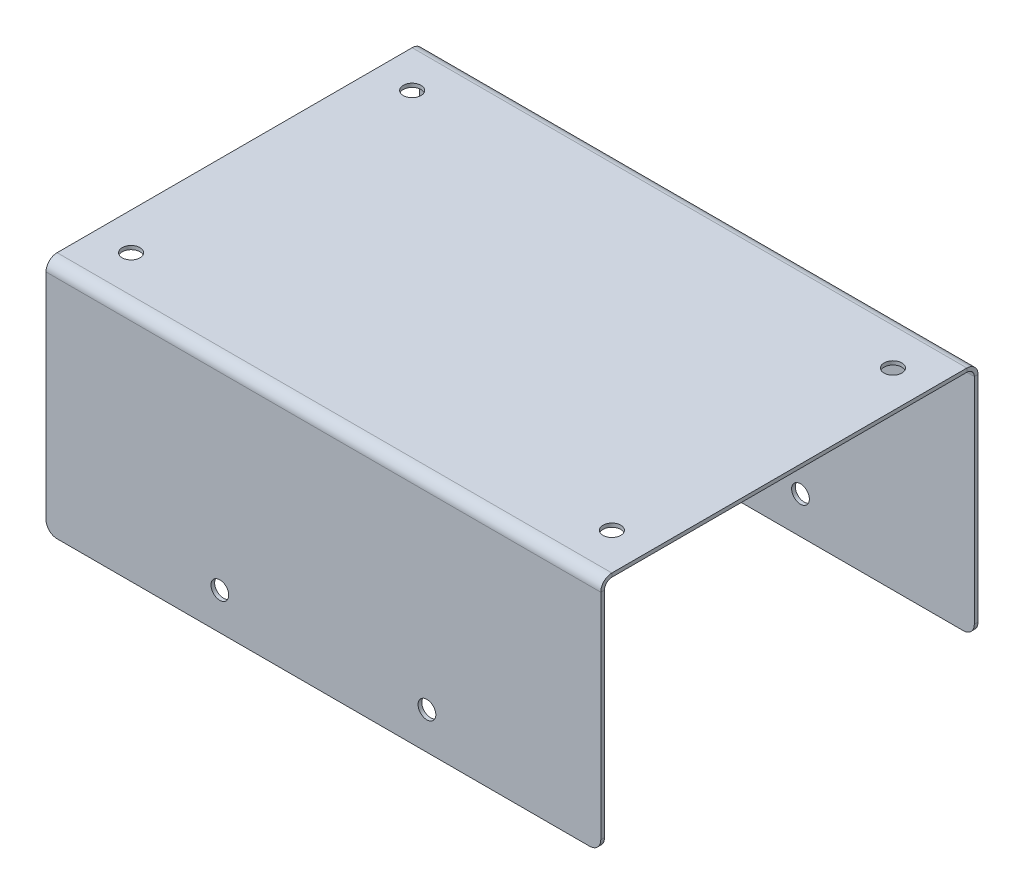
ISO-10303-21;
HEADER;
FILE_DESCRIPTION(('STEP AP214'),'2;1');
FILE_NAME('part.step','',(''),(''),'','','');
FILE_SCHEMA(('AUTOMOTIVE_DESIGN { 1 0 10303 214 1 1 1 1 }'));
ENDSEC;
DATA;
#1=APPLICATION_CONTEXT('core data for automotive mechanical design processes');
#2=APPLICATION_PROTOCOL_DEFINITION('international standard','automotive_design',2000,#1);
#3=PRODUCT_CONTEXT('',#1,'mechanical');
#4=PRODUCT('Part','Part','',(#3));
#5=PRODUCT_RELATED_PRODUCT_CATEGORY('part','',(#4));
#6=PRODUCT_DEFINITION_FORMATION('','',#4);
#7=PRODUCT_DEFINITION_CONTEXT('part definition',#1,'design');
#8=PRODUCT_DEFINITION('design','',#6,#7);
#9=PRODUCT_DEFINITION_SHAPE('','',#8);
#10=(LENGTH_UNIT() NAMED_UNIT(*) SI_UNIT(.MILLI.,.METRE.));
#11=(NAMED_UNIT(*) PLANE_ANGLE_UNIT() SI_UNIT($,.RADIAN.));
#12=(NAMED_UNIT(*) SI_UNIT($,.STERADIAN.) SOLID_ANGLE_UNIT());
#13=UNCERTAINTY_MEASURE_WITH_UNIT(LENGTH_MEASURE(1.E-05),#10,'distance_accuracy_value','');
#14=(GEOMETRIC_REPRESENTATION_CONTEXT(3) GLOBAL_UNCERTAINTY_ASSIGNED_CONTEXT((#13)) GLOBAL_UNIT_ASSIGNED_CONTEXT((#10,
#11,#12)) REPRESENTATION_CONTEXT('',''));
#15=CARTESIAN_POINT('',(0.,0.,0.));
#16=DIRECTION('',(0.,0.,1.));
#17=DIRECTION('',(1.,0.,0.));
#18=AXIS2_PLACEMENT_3D('',#15,#16,#17);
#19=CARTESIAN_POINT('',(0.,-1.,0.));
#20=DIRECTION('',(0.,-1.,0.));
#21=DIRECTION('',(0.,0.,-1.));
#22=AXIS2_PLACEMENT_3D('',#19,#20,#21);
#23=PLANE('',#22);
#24=CARTESIAN_POINT('',(-65.,-1.,-38.));
#25=DIRECTION('',(0.,-1.,0.));
#26=DIRECTION('',(0.,0.,-1.));
#27=AXIS2_PLACEMENT_3D('',#24,#25,#26);
#28=CIRCLE('',#27,2.39999999999999);
#29=CARTESIAN_POINT('',(-65.,-1.,-40.4));
#30=VERTEX_POINT('',#29);
#31=EDGE_CURVE('E659',#30,#30,#28,.T.);
#32=ORIENTED_EDGE('',*,*,#31,.F.);
#33=EDGE_LOOP('',(#32));
#34=FACE_BOUND('',#33,.T.);
#35=CARTESIAN_POINT('',(-65.,-1.,38.));
#36=DIRECTION('',(0.,-1.,0.));
#37=DIRECTION('',(0.,0.,-1.));
#38=AXIS2_PLACEMENT_3D('',#35,#36,#37);
#39=CIRCLE('',#38,2.39999999999999);
#40=CARTESIAN_POINT('',(-65.,-1.,35.6));
#41=VERTEX_POINT('',#40);
#42=EDGE_CURVE('E669',#41,#41,#39,.T.);
#43=ORIENTED_EDGE('',*,*,#42,.F.);
#44=EDGE_LOOP('',(#43));
#45=FACE_BOUND('',#44,.T.);
#46=CARTESIAN_POINT('',(65.,-1.,38.));
#47=DIRECTION('',(0.,-1.,0.));
#48=DIRECTION('',(0.,0.,-1.));
#49=AXIS2_PLACEMENT_3D('',#46,#47,#48);
#50=CIRCLE('',#49,2.39999999999999);
#51=CARTESIAN_POINT('',(65.,-1.,35.6));
#52=VERTEX_POINT('',#51);
#53=EDGE_CURVE('E675',#52,#52,#50,.T.);
#54=ORIENTED_EDGE('',*,*,#53,.F.);
#55=EDGE_LOOP('',(#54));
#56=FACE_BOUND('',#55,.T.);
#57=CARTESIAN_POINT('',(65.,-1.,-38.));
#58=DIRECTION('',(0.,-1.,0.));
#59=DIRECTION('',(0.,0.,-1.));
#60=AXIS2_PLACEMENT_3D('',#57,#58,#59);
#61=CIRCLE('',#60,2.39999999999999);
#62=CARTESIAN_POINT('',(65.,-1.,-40.4));
#63=VERTEX_POINT('',#62);
#64=EDGE_CURVE('E681',#63,#63,#61,.T.);
#65=ORIENTED_EDGE('',*,*,#64,.F.);
#66=EDGE_LOOP('',(#65));
#67=FACE_BOUND('',#66,.T.);
#68=DIRECTION('',(0.,0.,-1.));
#69=VECTOR('',#68,1.);
#70=CARTESIAN_POINT('',(75.,-1.,50.));
#71=LINE('',#70,#69);
#72=CARTESIAN_POINT('',(75.,-0.999999999999997,48.));
#73=VERTEX_POINT('',#72);
#74=CARTESIAN_POINT('',(75.,-1.,-48.));
#75=VERTEX_POINT('',#74);
#76=EDGE_CURVE('E262',#73,#75,#71,.T.);
#77=ORIENTED_EDGE('',*,*,#76,.F.);
#78=DIRECTION('',(-1.,0.,0.));
#79=VECTOR('',#78,1.);
#80=CARTESIAN_POINT('',(-75.,-0.999999999999997,48.));
#81=LINE('',#80,#79);
#82=CARTESIAN_POINT('',(-75.,-0.999999999999997,48.));
#83=VERTEX_POINT('',#82);
#84=EDGE_CURVE('E202',#83,#73,#81,.F.);
#85=ORIENTED_EDGE('',*,*,#84,.F.);
#86=DIRECTION('',(0.,0.,1.));
#87=VECTOR('',#86,1.);
#88=CARTESIAN_POINT('',(-75.,-1.,50.));
#89=LINE('',#88,#87);
#90=CARTESIAN_POINT('',(-75.,-1.,-48.));
#91=VERTEX_POINT('',#90);
#92=EDGE_CURVE('E264',#91,#83,#89,.T.);
#93=ORIENTED_EDGE('',*,*,#92,.F.);
#94=DIRECTION('',(1.,0.,0.));
#95=VECTOR('',#94,1.);
#96=CARTESIAN_POINT('',(75.,-1.,-48.));
#97=LINE('',#96,#95);
#98=EDGE_CURVE('E252',#75,#91,#97,.F.);
#99=ORIENTED_EDGE('',*,*,#98,.F.);
#100=EDGE_LOOP('',(#77,#85,#93,#99));
#101=FACE_BOUND('',#100,.T.);
#102=ADVANCED_FACE('F38',(#34,#45,#56,#67,#101),#23,.T.);
#103=CARTESIAN_POINT('',(0.,0.,0.));
#104=DIRECTION('',(0.,-1.,0.));
#105=DIRECTION('',(0.,0.,-1.));
#106=AXIS2_PLACEMENT_3D('',#103,#104,#105);
#107=PLANE('',#106);
#108=CARTESIAN_POINT('',(-65.,0.,-38.));
#109=DIRECTION('',(0.,1.,0.));
#110=DIRECTION('',(0.,0.,1.));
#111=AXIS2_PLACEMENT_3D('',#108,#109,#110);
#112=CIRCLE('',#111,2.39999999999999);
#113=CARTESIAN_POINT('',(-65.,0.,-35.6));
#114=VERTEX_POINT('',#113);
#115=EDGE_CURVE('E662',#114,#114,#112,.T.);
#116=ORIENTED_EDGE('',*,*,#115,.F.);
#117=EDGE_LOOP('',(#116));
#118=FACE_BOUND('',#117,.T.);
#119=CARTESIAN_POINT('',(-65.,0.,38.));
#120=DIRECTION('',(0.,1.,0.));
#121=DIRECTION('',(0.,0.,1.));
#122=AXIS2_PLACEMENT_3D('',#119,#120,#121);
#123=CIRCLE('',#122,2.39999999999999);
#124=CARTESIAN_POINT('',(-65.,0.,40.4));
#125=VERTEX_POINT('',#124);
#126=EDGE_CURVE('E664',#125,#125,#123,.T.);
#127=ORIENTED_EDGE('',*,*,#126,.F.);
#128=EDGE_LOOP('',(#127));
#129=FACE_BOUND('',#128,.T.);
#130=CARTESIAN_POINT('',(65.,0.,38.));
#131=DIRECTION('',(0.,1.,0.));
#132=DIRECTION('',(0.,0.,1.));
#133=AXIS2_PLACEMENT_3D('',#130,#131,#132);
#134=CIRCLE('',#133,2.39999999999999);
#135=CARTESIAN_POINT('',(65.,0.,40.4));
#136=VERTEX_POINT('',#135);
#137=EDGE_CURVE('E672',#136,#136,#134,.T.);
#138=ORIENTED_EDGE('',*,*,#137,.F.);
#139=EDGE_LOOP('',(#138));
#140=FACE_BOUND('',#139,.T.);
#141=CARTESIAN_POINT('',(65.,0.,-38.));
#142=DIRECTION('',(0.,1.,0.));
#143=DIRECTION('',(0.,0.,1.));
#144=AXIS2_PLACEMENT_3D('',#141,#142,#143);
#145=CIRCLE('',#144,2.39999999999999);
#146=CARTESIAN_POINT('',(65.,0.,-35.6));
#147=VERTEX_POINT('',#146);
#148=EDGE_CURVE('E678',#147,#147,#145,.T.);
#149=ORIENTED_EDGE('',*,*,#148,.F.);
#150=EDGE_LOOP('',(#149));
#151=FACE_BOUND('',#150,.T.);
#152=DIRECTION('',(-1.,0.,0.));
#153=VECTOR('',#152,1.);
#154=CARTESIAN_POINT('',(-75.,0.,48.));
#155=LINE('',#154,#153);
#156=CARTESIAN_POINT('',(-75.,0.,48.));
#157=VERTEX_POINT('',#156);
#158=CARTESIAN_POINT('',(75.,0.,48.));
#159=VERTEX_POINT('',#158);
#160=EDGE_CURVE('E168',#157,#159,#155,.F.);
#161=ORIENTED_EDGE('',*,*,#160,.T.);
#162=DIRECTION('',(0.,0.,-1.));
#163=VECTOR('',#162,1.);
#164=CARTESIAN_POINT('',(75.,0.,50.));
#165=LINE('',#164,#163);
#166=CARTESIAN_POINT('',(75.,0.,-48.));
#167=VERTEX_POINT('',#166);
#168=EDGE_CURVE('E260',#159,#167,#165,.T.);
#169=ORIENTED_EDGE('',*,*,#168,.T.);
#170=DIRECTION('',(1.,0.,0.));
#171=VECTOR('',#170,1.);
#172=CARTESIAN_POINT('',(75.,0.,-48.));
#173=LINE('',#172,#171);
#174=CARTESIAN_POINT('',(-75.,0.,-48.));
#175=VERTEX_POINT('',#174);
#176=EDGE_CURVE('E240',#167,#175,#173,.F.);
#177=ORIENTED_EDGE('',*,*,#176,.T.);
#178=DIRECTION('',(0.,0.,1.));
#179=VECTOR('',#178,1.);
#180=CARTESIAN_POINT('',(-75.,0.,50.));
#181=LINE('',#180,#179);
#182=EDGE_CURVE('E265',#175,#157,#181,.T.);
#183=ORIENTED_EDGE('',*,*,#182,.T.);
#184=EDGE_LOOP('',(#161,#169,#177,#183));
#185=FACE_BOUND('',#184,.T.);
#186=ADVANCED_FACE('F354',(#118,#129,#140,#151,#185),#107,.F.);
#187=CARTESIAN_POINT('',(-75.,-1.,50.));
#188=DIRECTION('',(-1.,0.,0.));
#189=DIRECTION('',(0.,0.,1.));
#190=AXIS2_PLACEMENT_3D('',#187,#188,#189);
#191=PLANE('',#190);
#192=ORIENTED_EDGE('',*,*,#92,.T.);
#193=DIRECTION('',(0.,1.,0.));
#194=VECTOR('',#193,1.);
#195=CARTESIAN_POINT('',(-75.,-0.999999999999997,48.));
#196=LINE('',#195,#194);
#197=EDGE_CURVE('E198',#83,#157,#196,.T.);
#198=ORIENTED_EDGE('',*,*,#197,.T.);
#199=ORIENTED_EDGE('',*,*,#182,.F.);
#200=DIRECTION('',(0.,1.,0.));
#201=VECTOR('',#200,1.);
#202=CARTESIAN_POINT('',(-75.,-1.,-48.));
#203=LINE('',#202,#201);
#204=EDGE_CURVE('E257',#91,#175,#203,.T.);
#205=ORIENTED_EDGE('',*,*,#204,.F.);
#206=EDGE_LOOP('',(#192,#198,#199,#205));
#207=FACE_BOUND('',#206,.T.);
#208=ADVANCED_FACE('F361',(#207),#191,.T.);
#209=CARTESIAN_POINT('',(75.,-1.,50.));
#210=DIRECTION('',(1.,0.,0.));
#211=DIRECTION('',(0.,0.,-1.));
#212=AXIS2_PLACEMENT_3D('',#209,#210,#211);
#213=PLANE('',#212);
#214=DIRECTION('',(0.,1.,0.));
#215=VECTOR('',#214,1.);
#216=CARTESIAN_POINT('',(75.,-0.999999999999997,48.));
#217=LINE('',#216,#215);
#218=EDGE_CURVE('E206',#73,#159,#217,.T.);
#219=ORIENTED_EDGE('',*,*,#218,.F.);
#220=ORIENTED_EDGE('',*,*,#76,.T.);
#221=DIRECTION('',(0.,1.,0.));
#222=VECTOR('',#221,1.);
#223=CARTESIAN_POINT('',(75.,-1.,-48.));
#224=LINE('',#223,#222);
#225=EDGE_CURVE('E246',#75,#167,#224,.T.);
#226=ORIENTED_EDGE('',*,*,#225,.T.);
#227=ORIENTED_EDGE('',*,*,#168,.F.);
#228=EDGE_LOOP('',(#219,#220,#226,#227));
#229=FACE_BOUND('',#228,.T.);
#230=ADVANCED_FACE('F372',(#229),#213,.T.);
#231=CARTESIAN_POINT('',(-75.,-3.00000000000001,-48.));
#232=DIRECTION('',(-1.,0.,0.));
#233=DIRECTION('',(0.,0.,1.));
#234=AXIS2_PLACEMENT_3D('',#231,#232,#233);
#235=PLANE('',#234);
#236=DIRECTION('',(0.,0.,-1.));
#237=VECTOR('',#236,1.);
#238=CARTESIAN_POINT('',(-75.,-3.,-50.));
#239=LINE('',#238,#237);
#240=CARTESIAN_POINT('',(-75.,-3.,-50.));
#241=VERTEX_POINT('',#240);
#242=CARTESIAN_POINT('',(-75.,-3.,-51.));
#243=VERTEX_POINT('',#242);
#244=EDGE_CURVE('E209',#241,#243,#239,.T.);
#245=ORIENTED_EDGE('',*,*,#244,.F.);
#246=CARTESIAN_POINT('',(-75.,-3.00000000000001,-48.));
#247=DIRECTION('',(1.,0.,0.));
#248=DIRECTION('',(0.,0.,-1.));
#249=AXIS2_PLACEMENT_3D('',#246,#247,#248);
#250=CIRCLE('',#249,2.);
#251=EDGE_CURVE('E249',#91,#241,#250,.F.);
#252=ORIENTED_EDGE('',*,*,#251,.F.);
#253=ORIENTED_EDGE('',*,*,#204,.T.);
#254=CARTESIAN_POINT('',(-75.,-3.00000000000001,-48.));
#255=DIRECTION('',(1.,0.,0.));
#256=DIRECTION('',(0.,0.,-1.));
#257=AXIS2_PLACEMENT_3D('',#254,#255,#256);
#258=CIRCLE('',#257,3.);
#259=EDGE_CURVE('E242',#175,#243,#258,.F.);
#260=ORIENTED_EDGE('',*,*,#259,.T.);
#261=EDGE_LOOP('',(#245,#252,#253,#260));
#262=FACE_BOUND('',#261,.T.);
#263=ADVANCED_FACE('F376',(#262),#235,.T.);
#264=CARTESIAN_POINT('',(75.,-3.00000000000001,-48.));
#265=DIRECTION('',(-1.,0.,0.));
#266=DIRECTION('',(0.,0.,1.));
#267=AXIS2_PLACEMENT_3D('',#264,#265,#266);
#268=PLANE('',#267);
#269=CARTESIAN_POINT('',(75.,-3.00000000000001,-48.));
#270=DIRECTION('',(1.,0.,0.));
#271=DIRECTION('',(0.,0.,-1.));
#272=AXIS2_PLACEMENT_3D('',#269,#270,#271);
#273=CIRCLE('',#272,2.);
#274=CARTESIAN_POINT('',(75.,-3.,-50.));
#275=VERTEX_POINT('',#274);
#276=EDGE_CURVE('E233',#275,#75,#273,.T.);
#277=ORIENTED_EDGE('',*,*,#276,.F.);
#278=DIRECTION('',(0.,0.,-1.));
#279=VECTOR('',#278,1.);
#280=CARTESIAN_POINT('',(75.,-2.99999999999999,-50.));
#281=LINE('',#280,#279);
#282=CARTESIAN_POINT('',(75.,-2.99999999999999,-51.));
#283=VERTEX_POINT('',#282);
#284=EDGE_CURVE('E215',#275,#283,#281,.T.);
#285=ORIENTED_EDGE('',*,*,#284,.T.);
#286=CARTESIAN_POINT('',(75.,-3.00000000000001,-48.));
#287=DIRECTION('',(1.,0.,0.));
#288=DIRECTION('',(0.,0.,-1.));
#289=AXIS2_PLACEMENT_3D('',#286,#287,#288);
#290=CIRCLE('',#289,3.);
#291=EDGE_CURVE('E243',#283,#167,#290,.T.);
#292=ORIENTED_EDGE('',*,*,#291,.T.);
#293=ORIENTED_EDGE('',*,*,#225,.F.);
#294=EDGE_LOOP('',(#277,#285,#292,#293));
#295=FACE_BOUND('',#294,.T.);
#296=ADVANCED_FACE('F367',(#295),#268,.F.);
#297=CARTESIAN_POINT('',(75.,-3.00000000000001,-48.));
#298=DIRECTION('',(1.,0.,0.));
#299=DIRECTION('',(0.,0.,-1.));
#300=AXIS2_PLACEMENT_3D('',#297,#298,#299);
#301=CYLINDRICAL_SURFACE('',#300,3.);
#302=ORIENTED_EDGE('',*,*,#176,.F.);
#303=ORIENTED_EDGE('',*,*,#291,.F.);
#304=DIRECTION('',(1.,0.,0.));
#305=VECTOR('',#304,1.);
#306=CARTESIAN_POINT('',(0.,-2.99999999999999,-51.));
#307=LINE('',#306,#305);
#308=EDGE_CURVE('E218',#243,#283,#307,.T.);
#309=ORIENTED_EDGE('',*,*,#308,.F.);
#310=ORIENTED_EDGE('',*,*,#259,.F.);
#311=EDGE_LOOP('',(#302,#303,#309,#310));
#312=FACE_BOUND('',#311,.T.);
#313=ADVANCED_FACE('F421',(#312),#301,.T.);
#314=CARTESIAN_POINT('',(75.,-3.00000000000001,-48.));
#315=DIRECTION('',(1.,0.,0.));
#316=DIRECTION('',(0.,0.,-1.));
#317=AXIS2_PLACEMENT_3D('',#314,#315,#316);
#318=CYLINDRICAL_SURFACE('',#317,2.);
#319=ORIENTED_EDGE('',*,*,#98,.T.);
#320=ORIENTED_EDGE('',*,*,#251,.T.);
#321=DIRECTION('',(1.,0.,0.));
#322=VECTOR('',#321,1.);
#323=CARTESIAN_POINT('',(-75.,-3.,-50.));
#324=LINE('',#323,#322);
#325=EDGE_CURVE('E212',#241,#275,#324,.T.);
#326=ORIENTED_EDGE('',*,*,#325,.T.);
#327=ORIENTED_EDGE('',*,*,#276,.T.);
#328=EDGE_LOOP('',(#319,#320,#326,#327));
#329=FACE_BOUND('',#328,.T.);
#330=ADVANCED_FACE('F407',(#329),#318,.F.);
#331=CARTESIAN_POINT('',(75.,-0.999999999999997,-51.));
#332=DIRECTION('',(1.,0.,0.));
#333=DIRECTION('',(0.,0.,-1.));
#334=AXIS2_PLACEMENT_3D('',#331,#332,#333);
#335=PLANE('',#334);
#336=DIRECTION('',(0.,1.,0.));
#337=VECTOR('',#336,1.);
#338=CARTESIAN_POINT('',(75.,-1.,-50.));
#339=LINE('',#338,#337);
#340=CARTESIAN_POINT('',(75.,-61.,-50.0000000000002));
#341=VERTEX_POINT('',#340);
#342=EDGE_CURVE('E228',#341,#275,#339,.T.);
#343=ORIENTED_EDGE('',*,*,#342,.F.);
#344=DIRECTION('',(0.,0.,1.));
#345=VECTOR('',#344,1.);
#346=CARTESIAN_POINT('',(75.,-61.,-51.0000000000002));
#347=LINE('',#346,#345);
#348=CARTESIAN_POINT('',(75.,-61.,-51.0000000000002));
#349=VERTEX_POINT('',#348);
#350=EDGE_CURVE('E280',#341,#349,#347,.F.);
#351=ORIENTED_EDGE('',*,*,#350,.T.);
#352=DIRECTION('',(0.,1.,0.));
#353=VECTOR('',#352,1.);
#354=CARTESIAN_POINT('',(75.,-0.999999999999997,-51.));
#355=LINE('',#354,#353);
#356=EDGE_CURVE('E231',#349,#283,#355,.T.);
#357=ORIENTED_EDGE('',*,*,#356,.T.);
#358=ORIENTED_EDGE('',*,*,#284,.F.);
#359=EDGE_LOOP('',(#343,#351,#357,#358));
#360=FACE_BOUND('',#359,.T.);
#361=ADVANCED_FACE('F415',(#360),#335,.T.);
#362=CARTESIAN_POINT('',(-75.,-64.,-51.0000000000002));
#363=DIRECTION('',(-1.,0.,0.));
#364=DIRECTION('',(0.,0.,1.));
#365=AXIS2_PLACEMENT_3D('',#362,#363,#364);
#366=PLANE('',#365);
#367=DIRECTION('',(0.,-1.,0.));
#368=VECTOR('',#367,1.);
#369=CARTESIAN_POINT('',(-75.,-64.,-51.0000000000002));
#370=LINE('',#369,#368);
#371=CARTESIAN_POINT('',(-75.,-61.,-51.0000000000002));
#372=VERTEX_POINT('',#371);
#373=EDGE_CURVE('E224',#243,#372,#370,.T.);
#374=ORIENTED_EDGE('',*,*,#373,.T.);
#375=DIRECTION('',(0.,0.,1.));
#376=VECTOR('',#375,1.);
#377=CARTESIAN_POINT('',(-75.,-61.,-51.0000000000002));
#378=LINE('',#377,#376);
#379=CARTESIAN_POINT('',(-75.,-61.,-50.0000000000002));
#380=VERTEX_POINT('',#379);
#381=EDGE_CURVE('E286',#372,#380,#378,.T.);
#382=ORIENTED_EDGE('',*,*,#381,.T.);
#383=DIRECTION('',(0.,-1.,0.));
#384=VECTOR('',#383,1.);
#385=CARTESIAN_POINT('',(-75.,-64.,-50.0000000000002));
#386=LINE('',#385,#384);
#387=EDGE_CURVE('E223',#241,#380,#386,.T.);
#388=ORIENTED_EDGE('',*,*,#387,.F.);
#389=ORIENTED_EDGE('',*,*,#244,.T.);
#390=EDGE_LOOP('',(#374,#382,#388,#389));
#391=FACE_BOUND('',#390,.T.);
#392=ADVANCED_FACE('F400',(#391),#366,.T.);
#393=CARTESIAN_POINT('',(0.,1.79717358263471E-13,-51.));
#394=DIRECTION('',(0.,0.,-1.));
#395=DIRECTION('',(0.,1.,0.));
#396=AXIS2_PLACEMENT_3D('',#393,#394,#395);
#397=PLANE('',#396);
#398=CARTESIAN_POINT('',(28.,-54.,-51.0000000000002));
#399=DIRECTION('',(0.,0.,-1.));
#400=DIRECTION('',(0.,1.,0.));
#401=AXIS2_PLACEMENT_3D('',#398,#399,#400);
#402=CIRCLE('',#401,2.4);
#403=CARTESIAN_POINT('',(28.,-51.6,-51.0000000000002));
#404=VERTEX_POINT('',#403);
#405=EDGE_CURVE('E684',#404,#404,#402,.T.);
#406=ORIENTED_EDGE('',*,*,#405,.F.);
#407=EDGE_LOOP('',(#406));
#408=FACE_BOUND('',#407,.T.);
#409=CARTESIAN_POINT('',(-28.,-54.,-51.0000000000002));
#410=DIRECTION('',(0.,0.,-1.));
#411=DIRECTION('',(0.,1.,0.));
#412=AXIS2_PLACEMENT_3D('',#409,#410,#411);
#413=CIRCLE('',#412,2.4);
#414=CARTESIAN_POINT('',(-28.,-51.6,-51.0000000000002));
#415=VERTEX_POINT('',#414);
#416=EDGE_CURVE('E311',#415,#415,#413,.T.);
#417=ORIENTED_EDGE('',*,*,#416,.F.);
#418=EDGE_LOOP('',(#417));
#419=FACE_BOUND('',#418,.T.);
#420=ORIENTED_EDGE('',*,*,#356,.F.);
#421=CARTESIAN_POINT('',(72.,-61.,-51.0000000000002));
#422=DIRECTION('',(0.,0.,-1.));
#423=DIRECTION('',(0.,1.,0.));
#424=AXIS2_PLACEMENT_3D('',#421,#422,#423);
#425=CIRCLE('',#424,3.);
#426=CARTESIAN_POINT('',(72.,-64.,-51.0000000000002));
#427=VERTEX_POINT('',#426);
#428=EDGE_CURVE('E284',#349,#427,#425,.T.);
#429=ORIENTED_EDGE('',*,*,#428,.T.);
#430=DIRECTION('',(1.,0.,0.));
#431=VECTOR('',#430,1.);
#432=CARTESIAN_POINT('',(75.,-64.,-51.0000000000002));
#433=LINE('',#432,#431);
#434=CARTESIAN_POINT('',(-72.,-64.,-51.0000000000002));
#435=VERTEX_POINT('',#434);
#436=EDGE_CURVE('E227',#435,#427,#433,.T.);
#437=ORIENTED_EDGE('',*,*,#436,.F.);
#438=CARTESIAN_POINT('',(-72.,-61.,-51.0000000000002));
#439=DIRECTION('',(0.,0.,-1.));
#440=DIRECTION('',(0.,1.,0.));
#441=AXIS2_PLACEMENT_3D('',#438,#439,#440);
#442=CIRCLE('',#441,3.);
#443=EDGE_CURVE('E282',#435,#372,#442,.T.);
#444=ORIENTED_EDGE('',*,*,#443,.T.);
#445=ORIENTED_EDGE('',*,*,#373,.F.);
#446=ORIENTED_EDGE('',*,*,#308,.T.);
#447=EDGE_LOOP('',(#420,#429,#437,#444,#445,#446));
#448=FACE_BOUND('',#447,.T.);
#449=ADVANCED_FACE('F391',(#408,#419,#448),#397,.T.);
#450=CARTESIAN_POINT('',(0.,1.76225876924628E-13,-50.));
#451=DIRECTION('',(0.,0.,-1.));
#452=DIRECTION('',(0.,1.,0.));
#453=AXIS2_PLACEMENT_3D('',#450,#451,#452);
#454=PLANE('',#453);
#455=CARTESIAN_POINT('',(28.,-54.,-50.0000000000002));
#456=DIRECTION('',(0.,0.,-1.));
#457=DIRECTION('',(0.,1.,0.));
#458=AXIS2_PLACEMENT_3D('',#455,#456,#457);
#459=CIRCLE('',#458,2.39999999999999);
#460=CARTESIAN_POINT('',(28.,-51.6,-50.0000000000002));
#461=VERTEX_POINT('',#460);
#462=EDGE_CURVE('E316',#461,#461,#459,.T.);
#463=ORIENTED_EDGE('',*,*,#462,.T.);
#464=EDGE_LOOP('',(#463));
#465=FACE_BOUND('',#464,.T.);
#466=CARTESIAN_POINT('',(-28.,-54.,-50.0000000000002));
#467=DIRECTION('',(0.,0.,-1.));
#468=DIRECTION('',(0.,1.,0.));
#469=AXIS2_PLACEMENT_3D('',#466,#467,#468);
#470=CIRCLE('',#469,2.39999999999999);
#471=CARTESIAN_POINT('',(-28.,-51.6,-50.0000000000002));
#472=VERTEX_POINT('',#471);
#473=EDGE_CURVE('E304',#472,#472,#470,.T.);
#474=ORIENTED_EDGE('',*,*,#473,.T.);
#475=EDGE_LOOP('',(#474));
#476=FACE_BOUND('',#475,.T.);
#477=DIRECTION('',(1.,0.,0.));
#478=VECTOR('',#477,1.);
#479=CARTESIAN_POINT('',(75.,-64.,-50.0000000000002));
#480=LINE('',#479,#478);
#481=CARTESIAN_POINT('',(-72.,-64.,-50.0000000000002));
#482=VERTEX_POINT('',#481);
#483=CARTESIAN_POINT('',(72.,-64.,-50.0000000000002));
#484=VERTEX_POINT('',#483);
#485=EDGE_CURVE('E236',#482,#484,#480,.T.);
#486=ORIENTED_EDGE('',*,*,#485,.T.);
#487=CARTESIAN_POINT('',(72.,-61.,-50.0000000000002));
#488=DIRECTION('',(0.,0.,-1.));
#489=DIRECTION('',(0.,1.,0.));
#490=AXIS2_PLACEMENT_3D('',#487,#488,#489);
#491=CIRCLE('',#490,3.);
#492=EDGE_CURVE('E278',#484,#341,#491,.F.);
#493=ORIENTED_EDGE('',*,*,#492,.T.);
#494=ORIENTED_EDGE('',*,*,#342,.T.);
#495=ORIENTED_EDGE('',*,*,#325,.F.);
#496=ORIENTED_EDGE('',*,*,#387,.T.);
#497=CARTESIAN_POINT('',(-72.,-61.,-50.0000000000002));
#498=DIRECTION('',(0.,0.,-1.));
#499=DIRECTION('',(0.,1.,0.));
#500=AXIS2_PLACEMENT_3D('',#497,#498,#499);
#501=CIRCLE('',#500,3.);
#502=EDGE_CURVE('E276',#380,#482,#501,.F.);
#503=ORIENTED_EDGE('',*,*,#502,.T.);
#504=EDGE_LOOP('',(#486,#493,#494,#495,#496,#503));
#505=FACE_BOUND('',#504,.T.);
#506=ADVANCED_FACE('F411',(#465,#476,#505),#454,.F.);
#507=CARTESIAN_POINT('',(75.,-64.,-51.0000000000002));
#508=DIRECTION('',(0.,-1.,0.));
#509=DIRECTION('',(0.,0.,-1.));
#510=AXIS2_PLACEMENT_3D('',#507,#508,#509);
#511=PLANE('',#510);
#512=ORIENTED_EDGE('',*,*,#436,.T.);
#513=DIRECTION('',(0.,0.,1.));
#514=VECTOR('',#513,1.);
#515=CARTESIAN_POINT('',(72.,-64.,-51.0000000000002));
#516=LINE('',#515,#514);
#517=EDGE_CURVE('E273',#427,#484,#516,.T.);
#518=ORIENTED_EDGE('',*,*,#517,.T.);
#519=ORIENTED_EDGE('',*,*,#485,.F.);
#520=DIRECTION('',(0.,0.,1.));
#521=VECTOR('',#520,1.);
#522=CARTESIAN_POINT('',(-72.,-64.,-51.0000000000002));
#523=LINE('',#522,#521);
#524=EDGE_CURVE('E268',#482,#435,#523,.F.);
#525=ORIENTED_EDGE('',*,*,#524,.T.);
#526=EDGE_LOOP('',(#512,#518,#519,#525));
#527=FACE_BOUND('',#526,.T.);
#528=ADVANCED_FACE('F394',(#527),#511,.T.);
#529=CARTESIAN_POINT('',(75.,-3.,48.));
#530=DIRECTION('',(1.,0.,0.));
#531=DIRECTION('',(0.,0.,-1.));
#532=AXIS2_PLACEMENT_3D('',#529,#530,#531);
#533=PLANE('',#532);
#534=DIRECTION('',(0.,0.,1.));
#535=VECTOR('',#534,1.);
#536=CARTESIAN_POINT('',(75.,-3.,50.));
#537=LINE('',#536,#535);
#538=CARTESIAN_POINT('',(75.,-2.99999999999999,50.));
#539=VERTEX_POINT('',#538);
#540=CARTESIAN_POINT('',(75.,-2.99999999999999,51.));
#541=VERTEX_POINT('',#540);
#542=EDGE_CURVE('E189',#539,#541,#537,.T.);
#543=ORIENTED_EDGE('',*,*,#542,.F.);
#544=CARTESIAN_POINT('',(75.,-3.,48.));
#545=DIRECTION('',(-1.,0.,0.));
#546=DIRECTION('',(0.,0.,1.));
#547=AXIS2_PLACEMENT_3D('',#544,#545,#546);
#548=CIRCLE('',#547,2.);
#549=EDGE_CURVE('E171',#73,#539,#548,.F.);
#550=ORIENTED_EDGE('',*,*,#549,.F.);
#551=ORIENTED_EDGE('',*,*,#218,.T.);
#552=CARTESIAN_POINT('',(75.,-3.,48.));
#553=DIRECTION('',(-1.,0.,0.));
#554=DIRECTION('',(0.,0.,1.));
#555=AXIS2_PLACEMENT_3D('',#552,#553,#554);
#556=CIRCLE('',#555,3.);
#557=EDGE_CURVE('E197',#159,#541,#556,.F.);
#558=ORIENTED_EDGE('',*,*,#557,.T.);
#559=EDGE_LOOP('',(#543,#550,#551,#558));
#560=FACE_BOUND('',#559,.T.);
#561=ADVANCED_FACE('F330',(#560),#533,.T.);
#562=CARTESIAN_POINT('',(-75.,-3.,48.));
#563=DIRECTION('',(1.,0.,0.));
#564=DIRECTION('',(0.,0.,-1.));
#565=AXIS2_PLACEMENT_3D('',#562,#563,#564);
#566=PLANE('',#565);
#567=CARTESIAN_POINT('',(-75.,-3.,48.));
#568=DIRECTION('',(-1.,0.,0.));
#569=DIRECTION('',(0.,0.,1.));
#570=AXIS2_PLACEMENT_3D('',#567,#568,#569);
#571=CIRCLE('',#570,2.);
#572=CARTESIAN_POINT('',(-75.,-2.99999999999999,50.));
#573=VERTEX_POINT('',#572);
#574=EDGE_CURVE('E157',#573,#83,#571,.T.);
#575=ORIENTED_EDGE('',*,*,#574,.F.);
#576=DIRECTION('',(0.,0.,1.));
#577=VECTOR('',#576,1.);
#578=CARTESIAN_POINT('',(-75.,-3.,50.));
#579=LINE('',#578,#577);
#580=CARTESIAN_POINT('',(-75.,-3.,51.));
#581=VERTEX_POINT('',#580);
#582=EDGE_CURVE('E155',#573,#581,#579,.T.);
#583=ORIENTED_EDGE('',*,*,#582,.T.);
#584=CARTESIAN_POINT('',(-75.,-3.,48.));
#585=DIRECTION('',(-1.,0.,0.));
#586=DIRECTION('',(0.,0.,1.));
#587=AXIS2_PLACEMENT_3D('',#584,#585,#586);
#588=CIRCLE('',#587,3.);
#589=EDGE_CURVE('E163',#581,#157,#588,.T.);
#590=ORIENTED_EDGE('',*,*,#589,.T.);
#591=ORIENTED_EDGE('',*,*,#197,.F.);
#592=EDGE_LOOP('',(#575,#583,#590,#591));
#593=FACE_BOUND('',#592,.T.);
#594=ADVANCED_FACE('F174',(#593),#566,.F.);
#595=CARTESIAN_POINT('',(-75.,-3.,48.));
#596=DIRECTION('',(-1.,0.,0.));
#597=DIRECTION('',(0.,0.,1.));
#598=AXIS2_PLACEMENT_3D('',#595,#596,#597);
#599=CYLINDRICAL_SURFACE('',#598,3.);
#600=ORIENTED_EDGE('',*,*,#160,.F.);
#601=ORIENTED_EDGE('',*,*,#589,.F.);
#602=DIRECTION('',(1.,0.,0.));
#603=VECTOR('',#602,1.);
#604=CARTESIAN_POINT('',(0.,-3.,51.));
#605=LINE('',#604,#603);
#606=EDGE_CURVE('E166',#581,#541,#605,.T.);
#607=ORIENTED_EDGE('',*,*,#606,.T.);
#608=ORIENTED_EDGE('',*,*,#557,.F.);
#609=EDGE_LOOP('',(#600,#601,#607,#608));
#610=FACE_BOUND('',#609,.T.);
#611=ADVANCED_FACE('F164',(#610),#599,.T.);
#612=CARTESIAN_POINT('',(-75.,-3.,48.));
#613=DIRECTION('',(-1.,0.,0.));
#614=DIRECTION('',(0.,0.,1.));
#615=AXIS2_PLACEMENT_3D('',#612,#613,#614);
#616=CYLINDRICAL_SURFACE('',#615,2.);
#617=ORIENTED_EDGE('',*,*,#84,.T.);
#618=ORIENTED_EDGE('',*,*,#549,.T.);
#619=DIRECTION('',(-1.,0.,0.));
#620=VECTOR('',#619,1.);
#621=CARTESIAN_POINT('',(75.,-3.,50.));
#622=LINE('',#621,#620);
#623=EDGE_CURVE('E176',#539,#573,#622,.T.);
#624=ORIENTED_EDGE('',*,*,#623,.T.);
#625=ORIENTED_EDGE('',*,*,#574,.T.);
#626=EDGE_LOOP('',(#617,#618,#624,#625));
#627=FACE_BOUND('',#626,.T.);
#628=ADVANCED_FACE('F331',(#627),#616,.F.);
#629=CARTESIAN_POINT('',(-75.,-64.,51.0000000000002));
#630=DIRECTION('',(-1.,0.,0.));
#631=DIRECTION('',(0.,0.,1.));
#632=AXIS2_PLACEMENT_3D('',#629,#630,#631);
#633=PLANE('',#632);
#634=DIRECTION('',(0.,1.,0.));
#635=VECTOR('',#634,1.);
#636=CARTESIAN_POINT('',(-75.,-64.,50.0000000000002));
#637=LINE('',#636,#635);
#638=CARTESIAN_POINT('',(-75.,-61.,50.0000000000002));
#639=VERTEX_POINT('',#638);
#640=EDGE_CURVE('E191',#639,#573,#637,.T.);
#641=ORIENTED_EDGE('',*,*,#640,.F.);
#642=DIRECTION('',(0.,0.,-1.));
#643=VECTOR('',#642,1.);
#644=CARTESIAN_POINT('',(-75.,-61.,51.0000000000002));
#645=LINE('',#644,#643);
#646=CARTESIAN_POINT('',(-75.,-61.,51.0000000000002));
#647=VERTEX_POINT('',#646);
#648=EDGE_CURVE('E11',#639,#647,#645,.F.);
#649=ORIENTED_EDGE('',*,*,#648,.T.);
#650=DIRECTION('',(0.,1.,0.));
#651=VECTOR('',#650,1.);
#652=CARTESIAN_POINT('',(-75.,-64.,51.0000000000002));
#653=LINE('',#652,#651);
#654=EDGE_CURVE('E151',#647,#581,#653,.T.);
#655=ORIENTED_EDGE('',*,*,#654,.T.);
#656=ORIENTED_EDGE('',*,*,#582,.F.);
#657=EDGE_LOOP('',(#641,#649,#655,#656));
#658=FACE_BOUND('',#657,.T.);
#659=ADVANCED_FACE('F153',(#658),#633,.T.);
#660=CARTESIAN_POINT('',(75.,-0.999999999999997,51.));
#661=DIRECTION('',(1.,0.,0.));
#662=DIRECTION('',(0.,0.,-1.));
#663=AXIS2_PLACEMENT_3D('',#660,#661,#662);
#664=PLANE('',#663);
#665=DIRECTION('',(0.,-1.,0.));
#666=VECTOR('',#665,1.);
#667=CARTESIAN_POINT('',(75.,-0.999999999999997,51.));
#668=LINE('',#667,#666);
#669=CARTESIAN_POINT('',(75.,-61.,51.0000000000002));
#670=VERTEX_POINT('',#669);
#671=EDGE_CURVE('E181',#541,#670,#668,.T.);
#672=ORIENTED_EDGE('',*,*,#671,.T.);
#673=DIRECTION('',(0.,0.,-1.));
#674=VECTOR('',#673,1.);
#675=CARTESIAN_POINT('',(75.,-61.,51.0000000000002));
#676=LINE('',#675,#674);
#677=CARTESIAN_POINT('',(75.,-61.,50.0000000000002));
#678=VERTEX_POINT('',#677);
#679=EDGE_CURVE('E289',#670,#678,#676,.T.);
#680=ORIENTED_EDGE('',*,*,#679,.T.);
#681=DIRECTION('',(0.,-1.,0.));
#682=VECTOR('',#681,1.);
#683=CARTESIAN_POINT('',(75.,-1.,50.));
#684=LINE('',#683,#682);
#685=EDGE_CURVE('E182',#539,#678,#684,.T.);
#686=ORIENTED_EDGE('',*,*,#685,.F.);
#687=ORIENTED_EDGE('',*,*,#542,.T.);
#688=EDGE_LOOP('',(#672,#680,#686,#687));
#689=FACE_BOUND('',#688,.T.);
#690=ADVANCED_FACE('F326',(#689),#664,.T.);
#691=CARTESIAN_POINT('',(0.,1.79717358263471E-13,51.));
#692=DIRECTION('',(0.,0.,-1.));
#693=DIRECTION('',(0.,1.,0.));
#694=AXIS2_PLACEMENT_3D('',#691,#692,#693);
#695=PLANE('',#694);
#696=CARTESIAN_POINT('',(28.,-54.0000000000003,51.0000000000003));
#697=DIRECTION('',(0.,0.,-1.));
#698=DIRECTION('',(0.,1.,0.));
#699=AXIS2_PLACEMENT_3D('',#696,#697,#698);
#700=CIRCLE('',#699,2.39999999999999);
#701=CARTESIAN_POINT('',(28.,-51.6000000000004,51.0000000000003));
#702=VERTEX_POINT('',#701);
#703=EDGE_CURVE('E687',#702,#702,#700,.T.);
#704=ORIENTED_EDGE('',*,*,#703,.T.);
#705=EDGE_LOOP('',(#704));
#706=FACE_BOUND('',#705,.T.);
#707=CARTESIAN_POINT('',(-28.,-54.0000000000003,51.0000000000003));
#708=DIRECTION('',(0.,0.,-1.));
#709=DIRECTION('',(0.,1.,0.));
#710=AXIS2_PLACEMENT_3D('',#707,#708,#709);
#711=CIRCLE('',#710,2.39999999999999);
#712=CARTESIAN_POINT('',(-28.,-51.6000000000004,51.0000000000003));
#713=VERTEX_POINT('',#712);
#714=EDGE_CURVE('E305',#713,#713,#711,.T.);
#715=ORIENTED_EDGE('',*,*,#714,.T.);
#716=EDGE_LOOP('',(#715));
#717=FACE_BOUND('',#716,.T.);
#718=DIRECTION('',(-1.,0.,0.));
#719=VECTOR('',#718,1.);
#720=CARTESIAN_POINT('',(75.,-64.,51.0000000000002));
#721=LINE('',#720,#719);
#722=CARTESIAN_POINT('',(72.,-64.,51.0000000000002));
#723=VERTEX_POINT('',#722);
#724=CARTESIAN_POINT('',(-72.,-64.,51.0000000000002));
#725=VERTEX_POINT('',#724);
#726=EDGE_CURVE('E158',#723,#725,#721,.T.);
#727=ORIENTED_EDGE('',*,*,#726,.F.);
#728=CARTESIAN_POINT('',(72.,-61.,51.0000000000002));
#729=DIRECTION('',(0.,0.,-1.));
#730=DIRECTION('',(0.,1.,0.));
#731=AXIS2_PLACEMENT_3D('',#728,#729,#730);
#732=CIRCLE('',#731,3.);
#733=EDGE_CURVE('E47',#723,#670,#732,.F.);
#734=ORIENTED_EDGE('',*,*,#733,.T.);
#735=ORIENTED_EDGE('',*,*,#671,.F.);
#736=ORIENTED_EDGE('',*,*,#606,.F.);
#737=ORIENTED_EDGE('',*,*,#654,.F.);
#738=CARTESIAN_POINT('',(-72.,-61.,51.0000000000002));
#739=DIRECTION('',(0.,0.,-1.));
#740=DIRECTION('',(0.,1.,0.));
#741=AXIS2_PLACEMENT_3D('',#738,#739,#740);
#742=CIRCLE('',#741,3.);
#743=EDGE_CURVE('E60',#647,#725,#742,.F.);
#744=ORIENTED_EDGE('',*,*,#743,.T.);
#745=EDGE_LOOP('',(#727,#734,#735,#736,#737,#744));
#746=FACE_BOUND('',#745,.T.);
#747=ADVANCED_FACE('F179',(#706,#717,#746),#695,.F.);
#748=CARTESIAN_POINT('',(0.,1.76225876924628E-13,50.));
#749=DIRECTION('',(0.,0.,-1.));
#750=DIRECTION('',(0.,1.,0.));
#751=AXIS2_PLACEMENT_3D('',#748,#749,#750);
#752=PLANE('',#751);
#753=CARTESIAN_POINT('',(28.,-54.0000000000003,50.0000000000002));
#754=DIRECTION('',(0.,0.,-1.));
#755=DIRECTION('',(0.,1.,0.));
#756=AXIS2_PLACEMENT_3D('',#753,#754,#755);
#757=CIRCLE('',#756,2.39999999999999);
#758=CARTESIAN_POINT('',(28.,-51.6000000000003,50.0000000000002));
#759=VERTEX_POINT('',#758);
#760=EDGE_CURVE('E42',#759,#759,#757,.T.);
#761=ORIENTED_EDGE('',*,*,#760,.F.);
#762=EDGE_LOOP('',(#761));
#763=FACE_BOUND('',#762,.T.);
#764=CARTESIAN_POINT('',(-28.,-54.0000000000003,50.0000000000002));
#765=DIRECTION('',(0.,0.,-1.));
#766=DIRECTION('',(0.,1.,0.));
#767=AXIS2_PLACEMENT_3D('',#764,#765,#766);
#768=CIRCLE('',#767,2.39999999999999);
#769=CARTESIAN_POINT('',(-28.,-51.6000000000003,50.0000000000002));
#770=VERTEX_POINT('',#769);
#771=EDGE_CURVE('E302',#770,#770,#768,.T.);
#772=ORIENTED_EDGE('',*,*,#771,.F.);
#773=EDGE_LOOP('',(#772));
#774=FACE_BOUND('',#773,.T.);
#775=ORIENTED_EDGE('',*,*,#685,.T.);
#776=CARTESIAN_POINT('',(72.,-61.,50.0000000000002));
#777=DIRECTION('',(0.,0.,-1.));
#778=DIRECTION('',(0.,1.,0.));
#779=AXIS2_PLACEMENT_3D('',#776,#777,#778);
#780=CIRCLE('',#779,3.);
#781=CARTESIAN_POINT('',(72.,-64.,50.0000000000002));
#782=VERTEX_POINT('',#781);
#783=EDGE_CURVE('E294',#678,#782,#780,.T.);
#784=ORIENTED_EDGE('',*,*,#783,.T.);
#785=DIRECTION('',(-1.,0.,0.));
#786=VECTOR('',#785,1.);
#787=CARTESIAN_POINT('',(75.,-64.,50.0000000000002));
#788=LINE('',#787,#786);
#789=CARTESIAN_POINT('',(-72.,-64.,50.0000000000002));
#790=VERTEX_POINT('',#789);
#791=EDGE_CURVE('E185',#782,#790,#788,.T.);
#792=ORIENTED_EDGE('',*,*,#791,.T.);
#793=CARTESIAN_POINT('',(-72.,-61.,50.0000000000002));
#794=DIRECTION('',(0.,0.,-1.));
#795=DIRECTION('',(0.,1.,0.));
#796=AXIS2_PLACEMENT_3D('',#793,#794,#795);
#797=CIRCLE('',#796,3.);
#798=EDGE_CURVE('E292',#790,#639,#797,.T.);
#799=ORIENTED_EDGE('',*,*,#798,.T.);
#800=ORIENTED_EDGE('',*,*,#640,.T.);
#801=ORIENTED_EDGE('',*,*,#623,.F.);
#802=EDGE_LOOP('',(#775,#784,#792,#799,#800,#801));
#803=FACE_BOUND('',#802,.T.);
#804=ADVANCED_FACE('F333',(#763,#774,#803),#752,.T.);
#805=CARTESIAN_POINT('',(75.,-64.,51.0000000000002));
#806=DIRECTION('',(0.,-1.,0.));
#807=DIRECTION('',(0.,0.,-1.));
#808=AXIS2_PLACEMENT_3D('',#805,#806,#807);
#809=PLANE('',#808);
#810=ORIENTED_EDGE('',*,*,#791,.F.);
#811=DIRECTION('',(0.,0.,-1.));
#812=VECTOR('',#811,1.);
#813=CARTESIAN_POINT('',(72.,-64.,51.0000000000002));
#814=LINE('',#813,#812);
#815=EDGE_CURVE('E299',#782,#723,#814,.F.);
#816=ORIENTED_EDGE('',*,*,#815,.T.);
#817=ORIENTED_EDGE('',*,*,#726,.T.);
#818=DIRECTION('',(0.,0.,-1.));
#819=VECTOR('',#818,1.);
#820=CARTESIAN_POINT('',(-72.,-64.,51.0000000000002));
#821=LINE('',#820,#819);
#822=EDGE_CURVE('E296',#725,#790,#821,.T.);
#823=ORIENTED_EDGE('',*,*,#822,.T.);
#824=EDGE_LOOP('',(#810,#816,#817,#823));
#825=FACE_BOUND('',#824,.T.);
#826=ADVANCED_FACE('F338',(#825),#809,.T.);
#827=CARTESIAN_POINT('',(72.,-61.,-51.0000000000002));
#828=DIRECTION('',(0.,0.,1.));
#829=DIRECTION('',(0.,-1.,0.));
#830=AXIS2_PLACEMENT_3D('',#827,#828,#829);
#831=CYLINDRICAL_SURFACE('',#830,3.);
#832=ORIENTED_EDGE('',*,*,#428,.F.);
#833=ORIENTED_EDGE('',*,*,#350,.F.);
#834=ORIENTED_EDGE('',*,*,#492,.F.);
#835=ORIENTED_EDGE('',*,*,#517,.F.);
#836=EDGE_LOOP('',(#832,#833,#834,#835));
#837=FACE_BOUND('',#836,.T.);
#838=ADVANCED_FACE('F350',(#837),#831,.T.);
#839=CARTESIAN_POINT('',(-72.,-61.,-51.0000000000002));
#840=DIRECTION('',(0.,0.,1.));
#841=DIRECTION('',(0.,-1.,0.));
#842=AXIS2_PLACEMENT_3D('',#839,#840,#841);
#843=CYLINDRICAL_SURFACE('',#842,3.);
#844=ORIENTED_EDGE('',*,*,#443,.F.);
#845=ORIENTED_EDGE('',*,*,#524,.F.);
#846=ORIENTED_EDGE('',*,*,#502,.F.);
#847=ORIENTED_EDGE('',*,*,#381,.F.);
#848=EDGE_LOOP('',(#844,#845,#846,#847));
#849=FACE_BOUND('',#848,.T.);
#850=ADVANCED_FACE('F344',(#849),#843,.T.);
#851=CARTESIAN_POINT('',(72.,-61.,51.0000000000002));
#852=DIRECTION('',(0.,0.,-1.));
#853=DIRECTION('',(0.,1.,0.));
#854=AXIS2_PLACEMENT_3D('',#851,#852,#853);
#855=CYLINDRICAL_SURFACE('',#854,3.);
#856=ORIENTED_EDGE('',*,*,#733,.F.);
#857=ORIENTED_EDGE('',*,*,#815,.F.);
#858=ORIENTED_EDGE('',*,*,#783,.F.);
#859=ORIENTED_EDGE('',*,*,#679,.F.);
#860=EDGE_LOOP('',(#856,#857,#858,#859));
#861=FACE_BOUND('',#860,.T.);
#862=ADVANCED_FACE('F342',(#861),#855,.T.);
#863=CARTESIAN_POINT('',(-72.,-61.,51.0000000000002));
#864=DIRECTION('',(0.,0.,-1.));
#865=DIRECTION('',(0.,1.,0.));
#866=AXIS2_PLACEMENT_3D('',#863,#864,#865);
#867=CYLINDRICAL_SURFACE('',#866,3.);
#868=ORIENTED_EDGE('',*,*,#743,.F.);
#869=ORIENTED_EDGE('',*,*,#648,.F.);
#870=ORIENTED_EDGE('',*,*,#798,.F.);
#871=ORIENTED_EDGE('',*,*,#822,.F.);
#872=EDGE_LOOP('',(#868,#869,#870,#871));
#873=FACE_BOUND('',#872,.T.);
#874=ADVANCED_FACE('F40',(#873),#867,.T.);
#875=CARTESIAN_POINT('',(-28.,-54.,-51.0000000000002));
#876=DIRECTION('',(0.,0.,-1.));
#877=DIRECTION('',(0.,1.,0.));
#878=AXIS2_PLACEMENT_3D('',#875,#876,#877);
#879=CYLINDRICAL_SURFACE('',#878,2.39999999999999);
#880=ORIENTED_EDGE('',*,*,#771,.T.);
#881=EDGE_LOOP('',(#880));
#882=FACE_BOUND('',#881,.T.);
#883=ORIENTED_EDGE('',*,*,#714,.F.);
#884=EDGE_LOOP('',(#883));
#885=FACE_BOUND('',#884,.T.);
#886=ADVANCED_FACE('F349',(#882,#885),#879,.F.);
#887=ORIENTED_EDGE('',*,*,#416,.T.);
#888=EDGE_LOOP('',(#887));
#889=FACE_BOUND('',#888,.T.);
#890=ORIENTED_EDGE('',*,*,#473,.F.);
#891=EDGE_LOOP('',(#890));
#892=FACE_BOUND('',#891,.T.);
#893=ADVANCED_FACE('F587',(#889,#892),#879,.F.);
#894=CARTESIAN_POINT('',(28.,-54.,-51.0000000000002));
#895=DIRECTION('',(0.,0.,-1.));
#896=DIRECTION('',(0.,1.,0.));
#897=AXIS2_PLACEMENT_3D('',#894,#895,#896);
#898=CYLINDRICAL_SURFACE('',#897,2.39999999999999);
#899=ORIENTED_EDGE('',*,*,#760,.T.);
#900=EDGE_LOOP('',(#899));
#901=FACE_BOUND('',#900,.T.);
#902=ORIENTED_EDGE('',*,*,#703,.F.);
#903=EDGE_LOOP('',(#902));
#904=FACE_BOUND('',#903,.T.);
#905=ADVANCED_FACE('F596',(#901,#904),#898,.F.);
#906=ORIENTED_EDGE('',*,*,#405,.T.);
#907=EDGE_LOOP('',(#906));
#908=FACE_BOUND('',#907,.T.);
#909=ORIENTED_EDGE('',*,*,#462,.F.);
#910=EDGE_LOOP('',(#909));
#911=FACE_BOUND('',#910,.T.);
#912=ADVANCED_FACE('F604',(#908,#911),#898,.F.);
#913=CARTESIAN_POINT('',(65.,0.,-38.));
#914=DIRECTION('',(0.,1.,0.));
#915=DIRECTION('',(0.,0.,1.));
#916=AXIS2_PLACEMENT_3D('',#913,#914,#915);
#917=CYLINDRICAL_SURFACE('',#916,2.39999999999999);
#918=ORIENTED_EDGE('',*,*,#64,.T.);
#919=EDGE_LOOP('',(#918));
#920=FACE_BOUND('',#919,.T.);
#921=ORIENTED_EDGE('',*,*,#148,.T.);
#922=EDGE_LOOP('',(#921));
#923=FACE_BOUND('',#922,.T.);
#924=ADVANCED_FACE('F613',(#920,#923),#917,.F.);
#925=CARTESIAN_POINT('',(65.,0.,38.));
#926=DIRECTION('',(0.,1.,0.));
#927=DIRECTION('',(0.,0.,1.));
#928=AXIS2_PLACEMENT_3D('',#925,#926,#927);
#929=CYLINDRICAL_SURFACE('',#928,2.39999999999999);
#930=ORIENTED_EDGE('',*,*,#53,.T.);
#931=EDGE_LOOP('',(#930));
#932=FACE_BOUND('',#931,.T.);
#933=ORIENTED_EDGE('',*,*,#137,.T.);
#934=EDGE_LOOP('',(#933));
#935=FACE_BOUND('',#934,.T.);
#936=ADVANCED_FACE('F623',(#932,#935),#929,.F.);
#937=CARTESIAN_POINT('',(-65.,0.,38.));
#938=DIRECTION('',(0.,1.,0.));
#939=DIRECTION('',(0.,0.,1.));
#940=AXIS2_PLACEMENT_3D('',#937,#938,#939);
#941=CYLINDRICAL_SURFACE('',#940,2.39999999999999);
#942=ORIENTED_EDGE('',*,*,#42,.T.);
#943=EDGE_LOOP('',(#942));
#944=FACE_BOUND('',#943,.T.);
#945=ORIENTED_EDGE('',*,*,#126,.T.);
#946=EDGE_LOOP('',(#945));
#947=FACE_BOUND('',#946,.T.);
#948=ADVANCED_FACE('F630',(#944,#947),#941,.F.);
#949=CARTESIAN_POINT('',(-65.,0.,-38.));
#950=DIRECTION('',(0.,1.,0.));
#951=DIRECTION('',(0.,0.,1.));
#952=AXIS2_PLACEMENT_3D('',#949,#950,#951);
#953=CYLINDRICAL_SURFACE('',#952,2.39999999999999);
#954=ORIENTED_EDGE('',*,*,#31,.T.);
#955=EDGE_LOOP('',(#954));
#956=FACE_BOUND('',#955,.T.);
#957=ORIENTED_EDGE('',*,*,#115,.T.);
#958=EDGE_LOOP('',(#957));
#959=FACE_BOUND('',#958,.T.);
#960=ADVANCED_FACE('F638',(#956,#959),#953,.F.);
#961=CLOSED_SHELL('',(#102,#186,#208,#230,#263,#296,#313,#330,#361,#392,#449,#506,#528,#561,
#594,#611,#628,#659,#690,#747,#804,#826,#838,#850,#862,#874,#886,#893,#905,#912,#924,#936,#948,#960));
#962=MANIFOLD_SOLID_BREP('B2',#961);
#963=ADVANCED_BREP_SHAPE_REPRESENTATION('',(#18,#962),#14);
#964=SHAPE_DEFINITION_REPRESENTATION(#9,#963);
ENDSEC;
END-ISO-10303-21;
